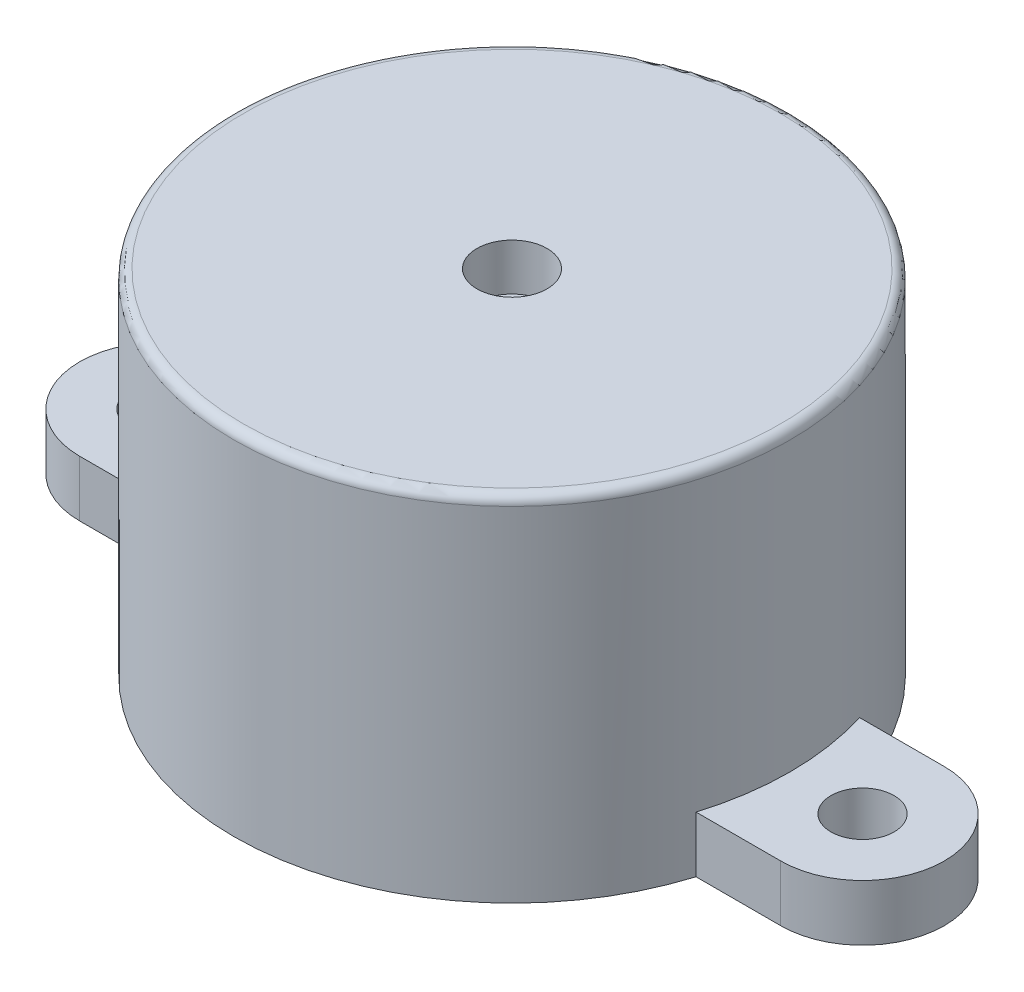
ISO-10303-21;
HEADER;
FILE_DESCRIPTION(('STEP AP214'),'2;1');
FILE_NAME('part.step','',(''),(''),'','','');
FILE_SCHEMA(('AUTOMOTIVE_DESIGN { 1 0 10303 214 1 1 1 1 }'));
ENDSEC;
DATA;
#1=APPLICATION_CONTEXT('core data for automotive mechanical design processes');
#2=APPLICATION_PROTOCOL_DEFINITION('international standard','automotive_design',2000,#1);
#3=PRODUCT_CONTEXT('',#1,'mechanical');
#4=PRODUCT('Part','Part','',(#3));
#5=PRODUCT_RELATED_PRODUCT_CATEGORY('part','',(#4));
#6=PRODUCT_DEFINITION_FORMATION('','',#4);
#7=PRODUCT_DEFINITION_CONTEXT('part definition',#1,'design');
#8=PRODUCT_DEFINITION('design','',#6,#7);
#9=PRODUCT_DEFINITION_SHAPE('','',#8);
#10=(LENGTH_UNIT() NAMED_UNIT(*) SI_UNIT(.MILLI.,.METRE.));
#11=(NAMED_UNIT(*) PLANE_ANGLE_UNIT() SI_UNIT($,.RADIAN.));
#12=(NAMED_UNIT(*) SI_UNIT($,.STERADIAN.) SOLID_ANGLE_UNIT());
#13=UNCERTAINTY_MEASURE_WITH_UNIT(LENGTH_MEASURE(1.E-05),#10,'distance_accuracy_value','');
#14=(GEOMETRIC_REPRESENTATION_CONTEXT(3) GLOBAL_UNCERTAINTY_ASSIGNED_CONTEXT((#13)) GLOBAL_UNIT_ASSIGNED_CONTEXT((#10,
#11,#12)) REPRESENTATION_CONTEXT('',''));
#15=CARTESIAN_POINT('',(0.,0.,0.));
#16=DIRECTION('',(0.,0.,1.));
#17=DIRECTION('',(1.,0.,0.));
#18=AXIS2_PLACEMENT_3D('',#15,#16,#17);
#19=CARTESIAN_POINT('',(0.,0.,0.));
#20=DIRECTION('',(0.,-1.,0.));
#21=DIRECTION('',(0.,0.,-1.));
#22=AXIS2_PLACEMENT_3D('',#19,#20,#21);
#23=PLANE('',#22);
#24=CARTESIAN_POINT('',(0.,0.,0.));
#25=DIRECTION('',(0.,-1.,0.));
#26=DIRECTION('',(0.,0.,-1.));
#27=AXIS2_PLACEMENT_3D('',#24,#25,#26);
#28=CIRCLE('',#27,15.113);
#29=CARTESIAN_POINT('',(-14.4445402834427,0.,-4.445));
#30=VERTEX_POINT('',#29);
#31=CARTESIAN_POINT('',(14.4445402834427,0.,-4.445));
#32=VERTEX_POINT('',#31);
#33=EDGE_CURVE('E155',#30,#32,#28,.T.);
#34=ORIENTED_EDGE('',*,*,#33,.T.);
#35=DIRECTION('',(1.,0.,0.));
#36=VECTOR('',#35,1.);
#37=CARTESIAN_POINT('',(-19.05,0.,-4.445));
#38=LINE('',#37,#36);
#39=CARTESIAN_POINT('',(19.05,0.,-4.445));
#40=VERTEX_POINT('',#39);
#41=EDGE_CURVE('E139',#32,#40,#38,.T.);
#42=ORIENTED_EDGE('',*,*,#41,.T.);
#43=CARTESIAN_POINT('',(19.05,0.,0.));
#44=DIRECTION('',(0.,-1.,0.));
#45=DIRECTION('',(0.,0.,-1.));
#46=AXIS2_PLACEMENT_3D('',#43,#44,#45);
#47=CIRCLE('',#46,4.445);
#48=CARTESIAN_POINT('',(19.05,0.,4.445));
#49=VERTEX_POINT('',#48);
#50=EDGE_CURVE('E142',#40,#49,#47,.T.);
#51=ORIENTED_EDGE('',*,*,#50,.T.);
#52=DIRECTION('',(-1.,0.,0.));
#53=VECTOR('',#52,1.);
#54=CARTESIAN_POINT('',(-19.05,0.,4.445));
#55=LINE('',#54,#53);
#56=CARTESIAN_POINT('',(14.4445402834427,0.,4.445));
#57=VERTEX_POINT('',#56);
#58=EDGE_CURVE('E55',#49,#57,#55,.T.);
#59=ORIENTED_EDGE('',*,*,#58,.T.);
#60=CARTESIAN_POINT('',(-14.4445402834427,0.,4.445));
#61=VERTEX_POINT('',#60);
#62=EDGE_CURVE('E157',#57,#61,#28,.T.);
#63=ORIENTED_EDGE('',*,*,#62,.T.);
#64=CARTESIAN_POINT('',(-19.05,0.,4.445));
#65=VERTEX_POINT('',#64);
#66=EDGE_CURVE('E126',#61,#65,#55,.T.);
#67=ORIENTED_EDGE('',*,*,#66,.T.);
#68=CARTESIAN_POINT('',(-19.05,0.,0.));
#69=DIRECTION('',(0.,-1.,0.));
#70=DIRECTION('',(0.,0.,1.));
#71=AXIS2_PLACEMENT_3D('',#68,#69,#70);
#72=CIRCLE('',#71,4.445);
#73=CARTESIAN_POINT('',(-19.05,0.,-4.445));
#74=VERTEX_POINT('',#73);
#75=EDGE_CURVE('E137',#65,#74,#72,.T.);
#76=ORIENTED_EDGE('',*,*,#75,.T.);
#77=EDGE_CURVE('E48',#74,#30,#38,.T.);
#78=ORIENTED_EDGE('',*,*,#77,.T.);
#79=EDGE_LOOP('',(#34,#42,#51,#59,#63,#67,#76,#78));
#80=FACE_BOUND('',#79,.T.);
#81=CARTESIAN_POINT('',(19.05,0.,0.));
#82=DIRECTION('',(0.,-1.,0.));
#83=DIRECTION('',(0.,0.,-1.));
#84=AXIS2_PLACEMENT_3D('',#81,#82,#83);
#85=CIRCLE('',#84,1.7145);
#86=CARTESIAN_POINT('',(19.05,0.,-1.7145));
#87=VERTEX_POINT('',#86);
#88=EDGE_CURVE('E129',#87,#87,#85,.T.);
#89=ORIENTED_EDGE('',*,*,#88,.F.);
#90=EDGE_LOOP('',(#89));
#91=FACE_BOUND('',#90,.T.);
#92=CARTESIAN_POINT('',(-19.05,0.,0.));
#93=DIRECTION('',(0.,-1.,0.));
#94=DIRECTION('',(0.,0.,1.));
#95=AXIS2_PLACEMENT_3D('',#92,#93,#94);
#96=CIRCLE('',#95,1.7145);
#97=CARTESIAN_POINT('',(-19.05,0.,-1.7145));
#98=VERTEX_POINT('',#97);
#99=EDGE_CURVE('E231',#98,#98,#96,.T.);
#100=ORIENTED_EDGE('',*,*,#99,.F.);
#101=EDGE_LOOP('',(#100));
#102=FACE_BOUND('',#101,.T.);
#103=ADVANCED_FACE('F33',(#80,#91,#102),#23,.T.);
#104=CARTESIAN_POINT('',(0.,0.,0.));
#105=DIRECTION('',(0.,-1.,0.));
#106=DIRECTION('',(0.,0.,-1.));
#107=AXIS2_PLACEMENT_3D('',#104,#105,#106);
#108=CYLINDRICAL_SURFACE('',#107,15.113);
#109=CARTESIAN_POINT('',(0.,18.669,0.));
#110=DIRECTION('',(0.,1.,0.));
#111=DIRECTION('',(0.,0.,1.));
#112=AXIS2_PLACEMENT_3D('',#109,#110,#111);
#113=CIRCLE('',#112,15.113);
#114=CARTESIAN_POINT('',(0.,18.669,15.113));
#115=VERTEX_POINT('',#114);
#116=EDGE_CURVE('E41',#115,#115,#113,.F.);
#117=ORIENTED_EDGE('',*,*,#116,.T.);
#118=EDGE_LOOP('',(#117));
#119=FACE_BOUND('',#118,.T.);
#120=DIRECTION('',(0.,-1.,0.));
#121=VECTOR('',#120,1.);
#122=CARTESIAN_POINT('',(-14.4445402834427,0.,4.445));
#123=LINE('',#122,#121);
#124=CARTESIAN_POINT('',(-14.4445402834427,3.048,4.445));
#125=VERTEX_POINT('',#124);
#126=EDGE_CURVE('E166',#61,#125,#123,.F.);
#127=ORIENTED_EDGE('',*,*,#126,.F.);
#128=ORIENTED_EDGE('',*,*,#62,.F.);
#129=DIRECTION('',(0.,-1.,0.));
#130=VECTOR('',#129,1.);
#131=CARTESIAN_POINT('',(14.4445402834427,0.,4.445));
#132=LINE('',#131,#130);
#133=CARTESIAN_POINT('',(14.4445402834427,3.048,4.445));
#134=VERTEX_POINT('',#133);
#135=EDGE_CURVE('E162',#134,#57,#132,.T.);
#136=ORIENTED_EDGE('',*,*,#135,.F.);
#137=CARTESIAN_POINT('',(0.,3.048,0.));
#138=DIRECTION('',(0.,1.,0.));
#139=DIRECTION('',(0.,0.,1.));
#140=AXIS2_PLACEMENT_3D('',#137,#138,#139);
#141=CIRCLE('',#140,15.113);
#142=CARTESIAN_POINT('',(14.4445402834427,3.048,-4.445));
#143=VERTEX_POINT('',#142);
#144=EDGE_CURVE('E158',#143,#134,#141,.F.);
#145=ORIENTED_EDGE('',*,*,#144,.F.);
#146=DIRECTION('',(0.,-1.,0.));
#147=VECTOR('',#146,1.);
#148=CARTESIAN_POINT('',(14.4445402834427,0.,-4.445));
#149=LINE('',#148,#147);
#150=EDGE_CURVE('E160',#32,#143,#149,.F.);
#151=ORIENTED_EDGE('',*,*,#150,.F.);
#152=ORIENTED_EDGE('',*,*,#33,.F.);
#153=DIRECTION('',(0.,-1.,0.));
#154=VECTOR('',#153,1.);
#155=CARTESIAN_POINT('',(-14.4445402834427,0.,-4.445));
#156=LINE('',#155,#154);
#157=CARTESIAN_POINT('',(-14.4445402834427,3.048,-4.445));
#158=VERTEX_POINT('',#157);
#159=EDGE_CURVE('E164',#158,#30,#156,.T.);
#160=ORIENTED_EDGE('',*,*,#159,.F.);
#161=EDGE_CURVE('E117',#125,#158,#141,.F.);
#162=ORIENTED_EDGE('',*,*,#161,.F.);
#163=EDGE_LOOP('',(#127,#128,#136,#145,#151,#152,#160,#162));
#164=FACE_BOUND('',#163,.T.);
#165=ADVANCED_FACE('F170',(#119,#164),#108,.T.);
#166=CARTESIAN_POINT('',(15.113,19.177,0.));
#167=DIRECTION('',(0.,1.,0.));
#168=DIRECTION('',(0.,0.,1.));
#169=AXIS2_PLACEMENT_3D('',#166,#167,#168);
#170=PLANE('',#169);
#171=CARTESIAN_POINT('',(0.,19.177,0.));
#172=DIRECTION('',(0.,1.,0.));
#173=DIRECTION('',(0.,0.,1.));
#174=AXIS2_PLACEMENT_3D('',#171,#172,#173);
#175=CIRCLE('',#174,14.605);
#176=CARTESIAN_POINT('',(0.,19.177,14.605));
#177=VERTEX_POINT('',#176);
#178=EDGE_CURVE('E11',#177,#177,#175,.T.);
#179=ORIENTED_EDGE('',*,*,#178,.T.);
#180=EDGE_LOOP('',(#179));
#181=FACE_BOUND('',#180,.T.);
#182=CARTESIAN_POINT('',(0.,19.177,0.));
#183=DIRECTION('',(0.,-1.,0.));
#184=DIRECTION('',(0.,0.,-1.));
#185=AXIS2_PLACEMENT_3D('',#182,#183,#184);
#186=CIRCLE('',#185,1.905);
#187=CARTESIAN_POINT('',(0.,19.177,-1.905));
#188=VERTEX_POINT('',#187);
#189=EDGE_CURVE('E152',#188,#188,#186,.T.);
#190=ORIENTED_EDGE('',*,*,#189,.T.);
#191=EDGE_LOOP('',(#190));
#192=FACE_BOUND('',#191,.T.);
#193=ADVANCED_FACE('F186',(#181,#192),#170,.T.);
#194=CARTESIAN_POINT('',(0.,0.,0.));
#195=DIRECTION('',(0.,-1.,0.));
#196=DIRECTION('',(0.,0.,-1.));
#197=AXIS2_PLACEMENT_3D('',#194,#195,#196);
#198=CYLINDRICAL_SURFACE('',#197,1.905);
#199=CARTESIAN_POINT('',(0.,16.637,0.));
#200=DIRECTION('',(0.,-1.,0.));
#201=DIRECTION('',(0.,0.,-1.));
#202=AXIS2_PLACEMENT_3D('',#199,#200,#201);
#203=CIRCLE('',#202,1.905);
#204=CARTESIAN_POINT('',(0.,16.637,-1.905));
#205=VERTEX_POINT('',#204);
#206=EDGE_CURVE('E145',#205,#205,#203,.T.);
#207=ORIENTED_EDGE('',*,*,#206,.T.);
#208=EDGE_LOOP('',(#207));
#209=FACE_BOUND('',#208,.T.);
#210=ORIENTED_EDGE('',*,*,#189,.F.);
#211=EDGE_LOOP('',(#210));
#212=FACE_BOUND('',#211,.T.);
#213=ADVANCED_FACE('F192',(#209,#212),#198,.F.);
#214=CARTESIAN_POINT('',(1.905,16.637,0.));
#215=DIRECTION('',(0.,1.,0.));
#216=DIRECTION('',(0.,0.,1.));
#217=AXIS2_PLACEMENT_3D('',#214,#215,#216);
#218=PLANE('',#217);
#219=ORIENTED_EDGE('',*,*,#206,.F.);
#220=EDGE_LOOP('',(#219));
#221=FACE_BOUND('',#220,.T.);
#222=ADVANCED_FACE('F196',(#221),#218,.T.);
#223=CARTESIAN_POINT('',(19.05,3.048,0.));
#224=DIRECTION('',(0.,-1.,0.));
#225=DIRECTION('',(0.,0.,-1.));
#226=AXIS2_PLACEMENT_3D('',#223,#224,#225);
#227=CYLINDRICAL_SURFACE('',#226,1.7145);
#228=CARTESIAN_POINT('',(19.05,3.048,0.));
#229=DIRECTION('',(0.,-1.,0.));
#230=DIRECTION('',(0.,0.,-1.));
#231=AXIS2_PLACEMENT_3D('',#228,#229,#230);
#232=CIRCLE('',#231,1.7145);
#233=CARTESIAN_POINT('',(19.05,3.048,-1.7145));
#234=VERTEX_POINT('',#233);
#235=EDGE_CURVE('E140',#234,#234,#232,.T.);
#236=CARTESIAN_POINT('',(19.05,3.048,-1.7145));
#237=CARTESIAN_POINT('',(19.05,3.01625,-1.7145));
#238=CARTESIAN_POINT('',(19.05,2.9845,-1.7145));
#239=CARTESIAN_POINT('',(19.05,2.921,-1.7145));
#240=CARTESIAN_POINT('',(19.05,2.88925,-1.7145));
#241=CARTESIAN_POINT('',(19.05,2.82575,-1.7145));
#242=CARTESIAN_POINT('',(19.05,2.794,-1.7145));
#243=CARTESIAN_POINT('',(19.05,2.7305,-1.7145));
#244=CARTESIAN_POINT('',(19.05,2.69875,-1.7145));
#245=CARTESIAN_POINT('',(19.05,2.63525,-1.7145));
#246=CARTESIAN_POINT('',(19.05,2.6035,-1.7145));
#247=CARTESIAN_POINT('',(19.05,2.54,-1.7145));
#248=CARTESIAN_POINT('',(19.05,2.50825,-1.7145));
#249=CARTESIAN_POINT('',(19.05,2.44475,-1.7145));
#250=CARTESIAN_POINT('',(19.05,2.413,-1.7145));
#251=CARTESIAN_POINT('',(19.05,2.3495,-1.7145));
#252=CARTESIAN_POINT('',(19.05,2.31775,-1.7145));
#253=CARTESIAN_POINT('',(19.05,2.25425,-1.7145));
#254=CARTESIAN_POINT('',(19.05,2.2225,-1.7145));
#255=CARTESIAN_POINT('',(19.05,2.159,-1.7145));
#256=CARTESIAN_POINT('',(19.05,2.12725,-1.7145));
#257=CARTESIAN_POINT('',(19.05,2.06375,-1.7145));
#258=CARTESIAN_POINT('',(19.05,2.032,-1.7145));
#259=CARTESIAN_POINT('',(19.05,1.9685,-1.7145));
#260=CARTESIAN_POINT('',(19.05,1.93675,-1.7145));
#261=CARTESIAN_POINT('',(19.05,1.87325,-1.7145));
#262=CARTESIAN_POINT('',(19.05,1.8415,-1.7145));
#263=CARTESIAN_POINT('',(19.05,1.778,-1.7145));
#264=CARTESIAN_POINT('',(19.05,1.74625,-1.7145));
#265=CARTESIAN_POINT('',(19.05,1.68275,-1.7145));
#266=CARTESIAN_POINT('',(19.05,1.651,-1.7145));
#267=CARTESIAN_POINT('',(19.05,1.5875,-1.7145));
#268=CARTESIAN_POINT('',(19.05,1.55575,-1.7145));
#269=CARTESIAN_POINT('',(19.05,1.49225,-1.7145));
#270=CARTESIAN_POINT('',(19.05,1.4605,-1.7145));
#271=CARTESIAN_POINT('',(19.05,1.397,-1.7145));
#272=CARTESIAN_POINT('',(19.05,1.36525,-1.7145));
#273=CARTESIAN_POINT('',(19.05,1.30175,-1.7145));
#274=CARTESIAN_POINT('',(19.05,1.27,-1.7145));
#275=CARTESIAN_POINT('',(19.05,1.2065,-1.7145));
#276=CARTESIAN_POINT('',(19.05,1.17475,-1.7145));
#277=CARTESIAN_POINT('',(19.05,1.11125,-1.7145));
#278=CARTESIAN_POINT('',(19.05,1.0795,-1.7145));
#279=CARTESIAN_POINT('',(19.05,1.016,-1.7145));
#280=CARTESIAN_POINT('',(19.05,0.98425,-1.7145));
#281=CARTESIAN_POINT('',(19.05,0.92075,-1.7145));
#282=CARTESIAN_POINT('',(19.05,0.889,-1.7145));
#283=CARTESIAN_POINT('',(19.05,0.8255,-1.7145));
#284=CARTESIAN_POINT('',(19.05,0.79375,-1.7145));
#285=CARTESIAN_POINT('',(19.05,0.73025,-1.7145));
#286=CARTESIAN_POINT('',(19.05,0.6985,-1.7145));
#287=CARTESIAN_POINT('',(19.05,0.635,-1.7145));
#288=CARTESIAN_POINT('',(19.05,0.60325,-1.7145));
#289=CARTESIAN_POINT('',(19.05,0.53975,-1.7145));
#290=CARTESIAN_POINT('',(19.05,0.508,-1.7145));
#291=CARTESIAN_POINT('',(19.05,0.4445,-1.7145));
#292=CARTESIAN_POINT('',(19.05,0.41275,-1.7145));
#293=CARTESIAN_POINT('',(19.05,0.34925,-1.7145));
#294=CARTESIAN_POINT('',(19.05,0.3175,-1.7145));
#295=CARTESIAN_POINT('',(19.05,0.254,-1.7145));
#296=CARTESIAN_POINT('',(19.05,0.22225,-1.7145));
#297=CARTESIAN_POINT('',(19.05,0.15875,-1.7145));
#298=CARTESIAN_POINT('',(19.05,0.127,-1.7145));
#299=CARTESIAN_POINT('',(19.05,0.0634999999999999,-1.7145));
#300=CARTESIAN_POINT('',(19.05,0.03175,-1.7145));
#301=CARTESIAN_POINT('',(19.05,0.,-1.7145));
#302=B_SPLINE_CURVE_WITH_KNOTS('',3,(#236,#237,#238,#239,#240,#241,#242,#243,#244,#245,#246,
#247,#248,#249,#250,#251,#252,#253,#254,#255,#256,#257,#258,#259,#260,#261,#262,#263,#264,#265,
#266,#267,#268,#269,#270,#271,#272,#273,#274,#275,#276,#277,#278,#279,#280,#281,#282,#283,#284,
#285,#286,#287,#288,#289,#290,#291,#292,#293,#294,#295,#296,#297,#298,#299,#300,#301),
.UNSPECIFIED.,.F.,.F.,(4,2,2,2,2,2,2,2,2,2,2,2,2,2,2,2,2,2,2,2,2,2,2,2,2,2,2,2,2,2,2,2,4),(0.,
0.0952500000000003,0.1905,0.28575,0.381,0.47625,0.5715,0.66675,0.762000000000001,0.85725,0.9525,
1.04775,1.143,1.23825,1.3335,1.42875,1.524,1.61925,1.7145,1.80975,1.905,2.00025,2.0955,2.19075,
2.286,2.38125,2.4765,2.57175,2.667,2.76225,2.8575,2.95275,3.048),.UNSPECIFIED.);
#303=EDGE_CURVE('BSEAM200',#234,#87,#302,.T.);
#304=ORIENTED_EDGE('',*,*,#235,.F.);
#305=ORIENTED_EDGE('',*,*,#88,.T.);
#306=ORIENTED_EDGE('',*,*,#303,.T.);
#307=ORIENTED_EDGE('',*,*,#303,.F.);
#308=EDGE_LOOP('',(#304,#306,#305,#307));
#309=FACE_BOUND('',#308,.T.);
#310=ADVANCED_FACE('F200',(#309),#227,.F.);
#311=CARTESIAN_POINT('',(19.05,3.048,0.));
#312=DIRECTION('',(0.,-1.,0.));
#313=DIRECTION('',(0.,0.,-1.));
#314=AXIS2_PLACEMENT_3D('',#311,#312,#313);
#315=CYLINDRICAL_SURFACE('',#314,4.445);
#316=ORIENTED_EDGE('',*,*,#50,.F.);
#317=DIRECTION('',(0.,-1.,0.));
#318=VECTOR('',#317,1.);
#319=CARTESIAN_POINT('',(19.05,3.048,-4.445));
#320=LINE('',#319,#318);
#321=CARTESIAN_POINT('',(19.05,3.048,-4.445));
#322=VERTEX_POINT('',#321);
#323=EDGE_CURVE('E108',#322,#40,#320,.T.);
#324=ORIENTED_EDGE('',*,*,#323,.F.);
#325=CARTESIAN_POINT('',(19.05,3.048,0.));
#326=DIRECTION('',(0.,-1.,0.));
#327=DIRECTION('',(0.,0.,-1.));
#328=AXIS2_PLACEMENT_3D('',#325,#326,#327);
#329=CIRCLE('',#328,4.445);
#330=CARTESIAN_POINT('',(19.05,3.048,4.445));
#331=VERTEX_POINT('',#330);
#332=EDGE_CURVE('E118',#322,#331,#329,.T.);
#333=ORIENTED_EDGE('',*,*,#332,.T.);
#334=DIRECTION('',(0.,-1.,0.));
#335=VECTOR('',#334,1.);
#336=CARTESIAN_POINT('',(19.05,3.048,4.445));
#337=LINE('',#336,#335);
#338=EDGE_CURVE('E146',#331,#49,#337,.T.);
#339=ORIENTED_EDGE('',*,*,#338,.T.);
#340=EDGE_LOOP('',(#316,#324,#333,#339));
#341=FACE_BOUND('',#340,.T.);
#342=ADVANCED_FACE('F207',(#341),#315,.T.);
#343=CARTESIAN_POINT('',(-19.05,3.048,0.));
#344=DIRECTION('',(0.,1.,0.));
#345=DIRECTION('',(0.,0.,1.));
#346=AXIS2_PLACEMENT_3D('',#343,#344,#345);
#347=PLANE('',#346);
#348=ORIENTED_EDGE('',*,*,#235,.T.);
#349=EDGE_LOOP('',(#348));
#350=FACE_BOUND('',#349,.T.);
#351=DIRECTION('',(1.,0.,0.));
#352=VECTOR('',#351,1.);
#353=CARTESIAN_POINT('',(-19.05,3.048,-4.445));
#354=LINE('',#353,#352);
#355=EDGE_CURVE('E119',#143,#322,#354,.T.);
#356=ORIENTED_EDGE('',*,*,#355,.F.);
#357=ORIENTED_EDGE('',*,*,#144,.T.);
#358=DIRECTION('',(-1.,0.,0.));
#359=VECTOR('',#358,1.);
#360=CARTESIAN_POINT('',(-19.05,3.048,4.445));
#361=LINE('',#360,#359);
#362=EDGE_CURVE('E109',#331,#134,#361,.T.);
#363=ORIENTED_EDGE('',*,*,#362,.F.);
#364=ORIENTED_EDGE('',*,*,#332,.F.);
#365=EDGE_LOOP('',(#356,#357,#363,#364));
#366=FACE_BOUND('',#365,.T.);
#367=ADVANCED_FACE('F210',(#350,#366),#347,.T.);
#368=CARTESIAN_POINT('',(-19.05,3.048,-4.445));
#369=DIRECTION('',(0.,0.,-1.));
#370=DIRECTION('',(-1.,0.,0.));
#371=AXIS2_PLACEMENT_3D('',#368,#369,#370);
#372=PLANE('',#371);
#373=ORIENTED_EDGE('',*,*,#41,.F.);
#374=ORIENTED_EDGE('',*,*,#150,.T.);
#375=ORIENTED_EDGE('',*,*,#355,.T.);
#376=ORIENTED_EDGE('',*,*,#323,.T.);
#377=EDGE_LOOP('',(#373,#374,#375,#376));
#378=FACE_BOUND('',#377,.T.);
#379=ADVANCED_FACE('F206',(#378),#372,.T.);
#380=CARTESIAN_POINT('',(-19.05,3.048,4.445));
#381=DIRECTION('',(0.,0.,1.));
#382=DIRECTION('',(1.,0.,0.));
#383=AXIS2_PLACEMENT_3D('',#380,#381,#382);
#384=PLANE('',#383);
#385=ORIENTED_EDGE('',*,*,#362,.T.);
#386=ORIENTED_EDGE('',*,*,#135,.T.);
#387=ORIENTED_EDGE('',*,*,#58,.F.);
#388=ORIENTED_EDGE('',*,*,#338,.F.);
#389=EDGE_LOOP('',(#385,#386,#387,#388));
#390=FACE_BOUND('',#389,.T.);
#391=ADVANCED_FACE('F212',(#390),#384,.T.);
#392=ORIENTED_EDGE('',*,*,#66,.F.);
#393=ORIENTED_EDGE('',*,*,#126,.T.);
#394=CARTESIAN_POINT('',(-19.05,3.048,4.445));
#395=VERTEX_POINT('',#394);
#396=EDGE_CURVE('E134',#125,#395,#361,.T.);
#397=ORIENTED_EDGE('',*,*,#396,.T.);
#398=DIRECTION('',(0.,-1.,0.));
#399=VECTOR('',#398,1.);
#400=CARTESIAN_POINT('',(-19.05,3.048,4.445));
#401=LINE('',#400,#399);
#402=EDGE_CURVE('E124',#395,#65,#401,.T.);
#403=ORIENTED_EDGE('',*,*,#402,.T.);
#404=EDGE_LOOP('',(#392,#393,#397,#403));
#405=FACE_BOUND('',#404,.T.);
#406=ADVANCED_FACE('F215',(#405),#384,.T.);
#407=CARTESIAN_POINT('',(-19.05,3.048,0.));
#408=DIRECTION('',(0.,-1.,0.));
#409=DIRECTION('',(0.,0.,1.));
#410=AXIS2_PLACEMENT_3D('',#407,#408,#409);
#411=CIRCLE('',#410,1.7145);
#412=CARTESIAN_POINT('',(-19.05,3.048,-1.7145));
#413=VERTEX_POINT('',#412);
#414=EDGE_CURVE('E229',#413,#413,#411,.T.);
#415=ORIENTED_EDGE('',*,*,#414,.T.);
#416=EDGE_LOOP('',(#415));
#417=FACE_BOUND('',#416,.T.);
#418=ORIENTED_EDGE('',*,*,#396,.F.);
#419=ORIENTED_EDGE('',*,*,#161,.T.);
#420=CARTESIAN_POINT('',(-19.05,3.048,-4.445));
#421=VERTEX_POINT('',#420);
#422=EDGE_CURVE('E103',#421,#158,#354,.T.);
#423=ORIENTED_EDGE('',*,*,#422,.F.);
#424=CARTESIAN_POINT('',(-19.05,3.048,0.));
#425=DIRECTION('',(0.,-1.,0.));
#426=DIRECTION('',(0.,0.,1.));
#427=AXIS2_PLACEMENT_3D('',#424,#425,#426);
#428=CIRCLE('',#427,4.445);
#429=EDGE_CURVE('E115',#395,#421,#428,.T.);
#430=ORIENTED_EDGE('',*,*,#429,.F.);
#431=EDGE_LOOP('',(#418,#419,#423,#430));
#432=FACE_BOUND('',#431,.T.);
#433=ADVANCED_FACE('F114',(#417,#432),#347,.T.);
#434=CARTESIAN_POINT('',(-19.05,3.048,0.));
#435=DIRECTION('',(0.,-1.,0.));
#436=DIRECTION('',(0.,0.,-1.));
#437=AXIS2_PLACEMENT_3D('',#434,#435,#436);
#438=CYLINDRICAL_SURFACE('',#437,4.445);
#439=ORIENTED_EDGE('',*,*,#75,.F.);
#440=ORIENTED_EDGE('',*,*,#402,.F.);
#441=ORIENTED_EDGE('',*,*,#429,.T.);
#442=DIRECTION('',(0.,-1.,0.));
#443=VECTOR('',#442,1.);
#444=CARTESIAN_POINT('',(-19.05,3.048,-4.445));
#445=LINE('',#444,#443);
#446=EDGE_CURVE('E100',#421,#74,#445,.T.);
#447=ORIENTED_EDGE('',*,*,#446,.T.);
#448=EDGE_LOOP('',(#439,#440,#441,#447));
#449=FACE_BOUND('',#448,.T.);
#450=ADVANCED_FACE('F122',(#449),#438,.T.);
#451=ORIENTED_EDGE('',*,*,#422,.T.);
#452=ORIENTED_EDGE('',*,*,#159,.T.);
#453=ORIENTED_EDGE('',*,*,#77,.F.);
#454=ORIENTED_EDGE('',*,*,#446,.F.);
#455=EDGE_LOOP('',(#451,#452,#453,#454));
#456=FACE_BOUND('',#455,.T.);
#457=ADVANCED_FACE('F102',(#456),#372,.T.);
#458=CARTESIAN_POINT('',(-19.05,3.048,0.));
#459=DIRECTION('',(0.,-1.,0.));
#460=DIRECTION('',(0.,0.,-1.));
#461=AXIS2_PLACEMENT_3D('',#458,#459,#460);
#462=CYLINDRICAL_SURFACE('',#461,1.7145);
#463=CARTESIAN_POINT('',(-19.05,3.048,-1.7145));
#464=CARTESIAN_POINT('',(-19.05,3.01625,-1.7145));
#465=CARTESIAN_POINT('',(-19.05,2.9845,-1.7145));
#466=CARTESIAN_POINT('',(-19.05,2.921,-1.7145));
#467=CARTESIAN_POINT('',(-19.05,2.88925,-1.7145));
#468=CARTESIAN_POINT('',(-19.05,2.82575,-1.7145));
#469=CARTESIAN_POINT('',(-19.05,2.794,-1.7145));
#470=CARTESIAN_POINT('',(-19.05,2.7305,-1.7145));
#471=CARTESIAN_POINT('',(-19.05,2.69875,-1.7145));
#472=CARTESIAN_POINT('',(-19.05,2.63525,-1.7145));
#473=CARTESIAN_POINT('',(-19.05,2.6035,-1.7145));
#474=CARTESIAN_POINT('',(-19.05,2.54,-1.7145));
#475=CARTESIAN_POINT('',(-19.05,2.50825,-1.7145));
#476=CARTESIAN_POINT('',(-19.05,2.44475,-1.7145));
#477=CARTESIAN_POINT('',(-19.05,2.413,-1.7145));
#478=CARTESIAN_POINT('',(-19.05,2.3495,-1.7145));
#479=CARTESIAN_POINT('',(-19.05,2.31775,-1.7145));
#480=CARTESIAN_POINT('',(-19.05,2.25425,-1.7145));
#481=CARTESIAN_POINT('',(-19.05,2.2225,-1.7145));
#482=CARTESIAN_POINT('',(-19.05,2.159,-1.7145));
#483=CARTESIAN_POINT('',(-19.05,2.12725,-1.7145));
#484=CARTESIAN_POINT('',(-19.05,2.06375,-1.7145));
#485=CARTESIAN_POINT('',(-19.05,2.032,-1.7145));
#486=CARTESIAN_POINT('',(-19.05,1.9685,-1.7145));
#487=CARTESIAN_POINT('',(-19.05,1.93675,-1.7145));
#488=CARTESIAN_POINT('',(-19.05,1.87325,-1.7145));
#489=CARTESIAN_POINT('',(-19.05,1.8415,-1.7145));
#490=CARTESIAN_POINT('',(-19.05,1.778,-1.7145));
#491=CARTESIAN_POINT('',(-19.05,1.74625,-1.7145));
#492=CARTESIAN_POINT('',(-19.05,1.68275,-1.7145));
#493=CARTESIAN_POINT('',(-19.05,1.651,-1.7145));
#494=CARTESIAN_POINT('',(-19.05,1.5875,-1.7145));
#495=CARTESIAN_POINT('',(-19.05,1.55575,-1.7145));
#496=CARTESIAN_POINT('',(-19.05,1.49225,-1.7145));
#497=CARTESIAN_POINT('',(-19.05,1.4605,-1.7145));
#498=CARTESIAN_POINT('',(-19.05,1.397,-1.7145));
#499=CARTESIAN_POINT('',(-19.05,1.36525,-1.7145));
#500=CARTESIAN_POINT('',(-19.05,1.30175,-1.7145));
#501=CARTESIAN_POINT('',(-19.05,1.27,-1.7145));
#502=CARTESIAN_POINT('',(-19.05,1.2065,-1.7145));
#503=CARTESIAN_POINT('',(-19.05,1.17475,-1.7145));
#504=CARTESIAN_POINT('',(-19.05,1.11125,-1.7145));
#505=CARTESIAN_POINT('',(-19.05,1.0795,-1.7145));
#506=CARTESIAN_POINT('',(-19.05,1.016,-1.7145));
#507=CARTESIAN_POINT('',(-19.05,0.98425,-1.7145));
#508=CARTESIAN_POINT('',(-19.05,0.92075,-1.7145));
#509=CARTESIAN_POINT('',(-19.05,0.889,-1.7145));
#510=CARTESIAN_POINT('',(-19.05,0.8255,-1.7145));
#511=CARTESIAN_POINT('',(-19.05,0.79375,-1.7145));
#512=CARTESIAN_POINT('',(-19.05,0.73025,-1.7145));
#513=CARTESIAN_POINT('',(-19.05,0.6985,-1.7145));
#514=CARTESIAN_POINT('',(-19.05,0.635,-1.7145));
#515=CARTESIAN_POINT('',(-19.05,0.60325,-1.7145));
#516=CARTESIAN_POINT('',(-19.05,0.53975,-1.7145));
#517=CARTESIAN_POINT('',(-19.05,0.508,-1.7145));
#518=CARTESIAN_POINT('',(-19.05,0.4445,-1.7145));
#519=CARTESIAN_POINT('',(-19.05,0.41275,-1.7145));
#520=CARTESIAN_POINT('',(-19.05,0.34925,-1.7145));
#521=CARTESIAN_POINT('',(-19.05,0.3175,-1.7145));
#522=CARTESIAN_POINT('',(-19.05,0.254,-1.7145));
#523=CARTESIAN_POINT('',(-19.05,0.22225,-1.7145));
#524=CARTESIAN_POINT('',(-19.05,0.15875,-1.7145));
#525=CARTESIAN_POINT('',(-19.05,0.127,-1.7145));
#526=CARTESIAN_POINT('',(-19.05,0.0634999999999999,-1.7145));
#527=CARTESIAN_POINT('',(-19.05,0.03175,-1.7145));
#528=CARTESIAN_POINT('',(-19.05,0.,-1.7145));
#529=B_SPLINE_CURVE_WITH_KNOTS('',3,(#463,#464,#465,#466,#467,#468,#469,#470,#471,#472,#473,
#474,#475,#476,#477,#478,#479,#480,#481,#482,#483,#484,#485,#486,#487,#488,#489,#490,#491,#492,
#493,#494,#495,#496,#497,#498,#499,#500,#501,#502,#503,#504,#505,#506,#507,#508,#509,#510,#511,
#512,#513,#514,#515,#516,#517,#518,#519,#520,#521,#522,#523,#524,#525,#526,#527,#528),
.UNSPECIFIED.,.F.,.F.,(4,2,2,2,2,2,2,2,2,2,2,2,2,2,2,2,2,2,2,2,2,2,2,2,2,2,2,2,2,2,2,2,4),(0.,
0.0952500000000003,0.1905,0.28575,0.381,0.47625,0.5715,0.66675,0.762000000000001,0.85725,0.9525,
1.04775,1.143,1.23825,1.3335,1.42875,1.524,1.61925,1.7145,1.80975,1.905,2.00025,2.0955,2.19075,
2.286,2.38125,2.4765,2.57175,2.667,2.76225,2.8575,2.95275,3.048),.UNSPECIFIED.);
#530=EDGE_CURVE('BSEAM174',#413,#98,#529,.T.);
#531=ORIENTED_EDGE('',*,*,#414,.F.);
#532=ORIENTED_EDGE('',*,*,#99,.T.);
#533=ORIENTED_EDGE('',*,*,#530,.T.);
#534=ORIENTED_EDGE('',*,*,#530,.F.);
#535=EDGE_LOOP('',(#531,#533,#532,#534));
#536=FACE_BOUND('',#535,.T.);
#537=ADVANCED_FACE('F174',(#536),#462,.F.);
#538=CARTESIAN_POINT('',(0.,18.669,0.));
#539=DIRECTION('',(0.,1.,0.));
#540=DIRECTION('',(0.,0.,1.));
#541=AXIS2_PLACEMENT_3D('',#538,#539,#540);
#542=TOROIDAL_SURFACE('',#541,14.605,0.508);
#543=ORIENTED_EDGE('',*,*,#178,.F.);
#544=EDGE_LOOP('',(#543));
#545=FACE_BOUND('',#544,.T.);
#546=ORIENTED_EDGE('',*,*,#116,.F.);
#547=EDGE_LOOP('',(#546));
#548=FACE_BOUND('',#547,.T.);
#549=ADVANCED_FACE('F35',(#545,#548),#542,.T.);
#550=CLOSED_SHELL('',(#103,#165,#193,#213,#222,#310,#342,#367,#379,#391,#406,#433,#450,#457,
#537,#549));
#551=MANIFOLD_SOLID_BREP('B2',#550);
#552=ADVANCED_BREP_SHAPE_REPRESENTATION('',(#18,#551),#14);
#553=SHAPE_DEFINITION_REPRESENTATION(#9,#552);
ENDSEC;
END-ISO-10303-21;
